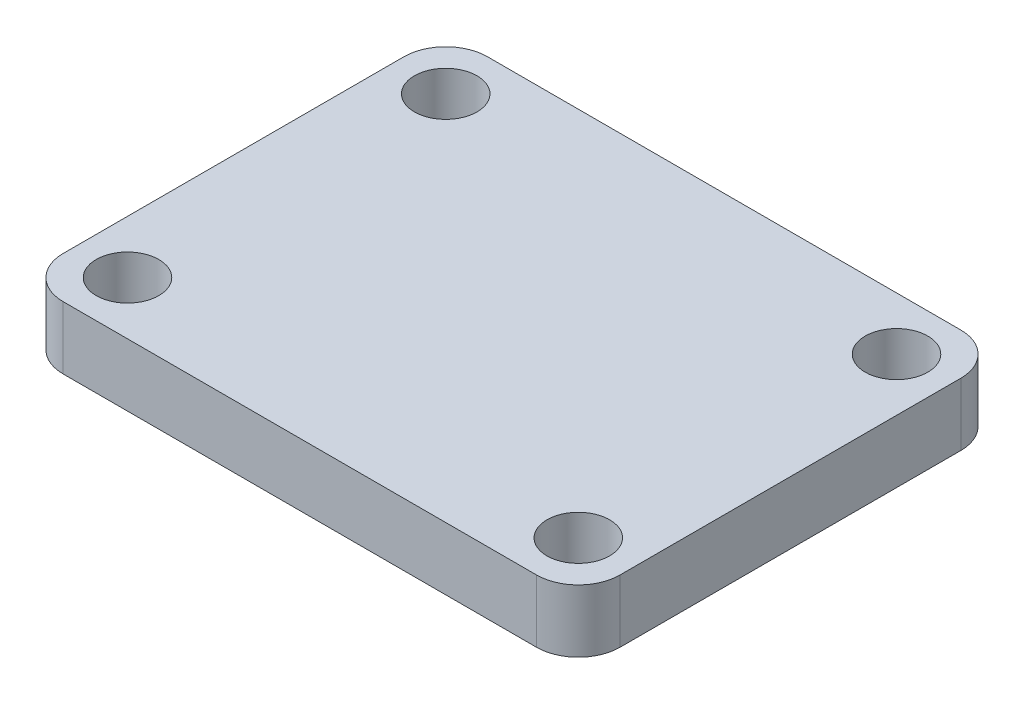
ISO-10303-21;
HEADER;
FILE_DESCRIPTION(('STEP AP214'),'2;1');
FILE_NAME('part.step','',(''),(''),'','','');
FILE_SCHEMA(('AUTOMOTIVE_DESIGN { 1 0 10303 214 1 1 1 1 }'));
ENDSEC;
DATA;
#1=APPLICATION_CONTEXT('core data for automotive mechanical design processes');
#2=APPLICATION_PROTOCOL_DEFINITION('international standard','automotive_design',2000,#1);
#3=PRODUCT_CONTEXT('',#1,'mechanical');
#4=PRODUCT('Part','Part','',(#3));
#5=PRODUCT_RELATED_PRODUCT_CATEGORY('part','',(#4));
#6=PRODUCT_DEFINITION_FORMATION('','',#4);
#7=PRODUCT_DEFINITION_CONTEXT('part definition',#1,'design');
#8=PRODUCT_DEFINITION('design','',#6,#7);
#9=PRODUCT_DEFINITION_SHAPE('','',#8);
#10=(LENGTH_UNIT() NAMED_UNIT(*) SI_UNIT(.MILLI.,.METRE.));
#11=(NAMED_UNIT(*) PLANE_ANGLE_UNIT() SI_UNIT($,.RADIAN.));
#12=(NAMED_UNIT(*) SI_UNIT($,.STERADIAN.) SOLID_ANGLE_UNIT());
#13=UNCERTAINTY_MEASURE_WITH_UNIT(LENGTH_MEASURE(1.E-05),#10,'distance_accuracy_value','');
#14=(GEOMETRIC_REPRESENTATION_CONTEXT(3) GLOBAL_UNCERTAINTY_ASSIGNED_CONTEXT((#13)) GLOBAL_UNIT_ASSIGNED_CONTEXT((#10,
#11,#12)) REPRESENTATION_CONTEXT('',''));
#15=CARTESIAN_POINT('',(0.,0.,0.));
#16=DIRECTION('',(0.,0.,1.));
#17=DIRECTION('',(1.,0.,0.));
#18=AXIS2_PLACEMENT_3D('',#15,#16,#17);
#19=CARTESIAN_POINT('',(0.,3.,-20.32));
#20=DIRECTION('',(0.,0.,-1.));
#21=DIRECTION('',(-1.,0.,0.));
#22=AXIS2_PLACEMENT_3D('',#19,#20,#21);
#23=PLANE('',#22);
#24=DIRECTION('',(1.,0.,0.));
#25=VECTOR('',#24,1.);
#26=CARTESIAN_POINT('',(0.,3.,-20.32));
#27=LINE('',#26,#25);
#28=CARTESIAN_POINT('',(2.,3.,-20.32));
#29=VERTEX_POINT('',#28);
#30=CARTESIAN_POINT('',(24.67,3.,-20.32));
#31=VERTEX_POINT('',#30);
#32=EDGE_CURVE('E162',#29,#31,#27,.T.);
#33=ORIENTED_EDGE('',*,*,#32,.T.);
#34=DIRECTION('',(0.,-1.,0.));
#35=VECTOR('',#34,1.);
#36=CARTESIAN_POINT('',(24.67,0.,-20.32));
#37=LINE('',#36,#35);
#38=CARTESIAN_POINT('',(24.67,0.,-20.32));
#39=VERTEX_POINT('',#38);
#40=EDGE_CURVE('E109',#31,#39,#37,.T.);
#41=ORIENTED_EDGE('',*,*,#40,.T.);
#42=DIRECTION('',(1.,0.,0.));
#43=VECTOR('',#42,1.);
#44=CARTESIAN_POINT('',(0.,0.,-20.32));
#45=LINE('',#44,#43);
#46=CARTESIAN_POINT('',(2.,0.,-20.32));
#47=VERTEX_POINT('',#46);
#48=EDGE_CURVE('E101',#47,#39,#45,.T.);
#49=ORIENTED_EDGE('',*,*,#48,.F.);
#50=DIRECTION('',(0.,-1.,0.));
#51=VECTOR('',#50,1.);
#52=CARTESIAN_POINT('',(2.,3.,-20.32));
#53=LINE('',#52,#51);
#54=EDGE_CURVE('E114',#47,#29,#53,.F.);
#55=ORIENTED_EDGE('',*,*,#54,.T.);
#56=EDGE_LOOP('',(#33,#41,#49,#55));
#57=FACE_BOUND('',#56,.T.);
#58=ADVANCED_FACE('F32',(#57),#23,.T.);
#59=CARTESIAN_POINT('',(0.,3.,0.));
#60=DIRECTION('',(-1.,0.,0.));
#61=DIRECTION('',(0.,0.,1.));
#62=AXIS2_PLACEMENT_3D('',#59,#60,#61);
#63=PLANE('',#62);
#64=DIRECTION('',(0.,0.,-1.));
#65=VECTOR('',#64,1.);
#66=CARTESIAN_POINT('',(0.,0.,0.));
#67=LINE('',#66,#65);
#68=CARTESIAN_POINT('',(0.,0.,-2.));
#69=VERTEX_POINT('',#68);
#70=CARTESIAN_POINT('',(0.,0.,-18.32));
#71=VERTEX_POINT('',#70);
#72=EDGE_CURVE('E103',#69,#71,#67,.T.);
#73=ORIENTED_EDGE('',*,*,#72,.F.);
#74=DIRECTION('',(0.,-1.,0.));
#75=VECTOR('',#74,1.);
#76=CARTESIAN_POINT('',(0.,3.,-2.));
#77=LINE('',#76,#75);
#78=CARTESIAN_POINT('',(0.,3.,-2.));
#79=VERTEX_POINT('',#78);
#80=EDGE_CURVE('E11',#69,#79,#77,.F.);
#81=ORIENTED_EDGE('',*,*,#80,.T.);
#82=DIRECTION('',(0.,0.,-1.));
#83=VECTOR('',#82,1.);
#84=CARTESIAN_POINT('',(0.,3.,0.));
#85=LINE('',#84,#83);
#86=CARTESIAN_POINT('',(0.,3.,-18.32));
#87=VERTEX_POINT('',#86);
#88=EDGE_CURVE('E122',#79,#87,#85,.T.);
#89=ORIENTED_EDGE('',*,*,#88,.T.);
#90=DIRECTION('',(0.,-1.,0.));
#91=VECTOR('',#90,1.);
#92=CARTESIAN_POINT('',(0.,3.,-18.32));
#93=LINE('',#92,#91);
#94=EDGE_CURVE('E40',#87,#71,#93,.T.);
#95=ORIENTED_EDGE('',*,*,#94,.T.);
#96=EDGE_LOOP('',(#73,#81,#89,#95));
#97=FACE_BOUND('',#96,.T.);
#98=ADVANCED_FACE('F151',(#97),#63,.T.);
#99=CARTESIAN_POINT('',(0.,3.,0.));
#100=DIRECTION('',(0.,0.,-1.));
#101=DIRECTION('',(-1.,0.,0.));
#102=AXIS2_PLACEMENT_3D('',#99,#100,#101);
#103=PLANE('',#102);
#104=DIRECTION('',(1.,0.,0.));
#105=VECTOR('',#104,1.);
#106=CARTESIAN_POINT('',(0.,0.,0.));
#107=LINE('',#106,#105);
#108=CARTESIAN_POINT('',(2.,0.,0.));
#109=VERTEX_POINT('',#108);
#110=CARTESIAN_POINT('',(24.67,0.,0.));
#111=VERTEX_POINT('',#110);
#112=EDGE_CURVE('E160',#109,#111,#107,.T.);
#113=ORIENTED_EDGE('',*,*,#112,.T.);
#114=DIRECTION('',(0.,-1.,0.));
#115=VECTOR('',#114,1.);
#116=CARTESIAN_POINT('',(24.67,3.,0.));
#117=LINE('',#116,#115);
#118=CARTESIAN_POINT('',(24.67,3.,0.));
#119=VERTEX_POINT('',#118);
#120=EDGE_CURVE('E47',#111,#119,#117,.F.);
#121=ORIENTED_EDGE('',*,*,#120,.T.);
#122=DIRECTION('',(1.,0.,0.));
#123=VECTOR('',#122,1.);
#124=CARTESIAN_POINT('',(0.,3.,0.));
#125=LINE('',#124,#123);
#126=CARTESIAN_POINT('',(2.,3.,0.));
#127=VERTEX_POINT('',#126);
#128=EDGE_CURVE('E126',#127,#119,#125,.T.);
#129=ORIENTED_EDGE('',*,*,#128,.F.);
#130=DIRECTION('',(0.,-1.,0.));
#131=VECTOR('',#130,1.);
#132=CARTESIAN_POINT('',(2.,0.,0.));
#133=LINE('',#132,#131);
#134=EDGE_CURVE('E147',#127,#109,#133,.T.);
#135=ORIENTED_EDGE('',*,*,#134,.T.);
#136=EDGE_LOOP('',(#113,#121,#129,#135));
#137=FACE_BOUND('',#136,.T.);
#138=ADVANCED_FACE('F159',(#137),#103,.F.);
#139=CARTESIAN_POINT('',(26.67,3.,0.));
#140=DIRECTION('',(-1.,0.,0.));
#141=DIRECTION('',(0.,0.,1.));
#142=AXIS2_PLACEMENT_3D('',#139,#140,#141);
#143=PLANE('',#142);
#144=DIRECTION('',(0.,0.,-1.));
#145=VECTOR('',#144,1.);
#146=CARTESIAN_POINT('',(26.67,0.,0.));
#147=LINE('',#146,#145);
#148=CARTESIAN_POINT('',(26.67,0.,-2.));
#149=VERTEX_POINT('',#148);
#150=CARTESIAN_POINT('',(26.67,0.,-18.32));
#151=VERTEX_POINT('',#150);
#152=EDGE_CURVE('E117',#149,#151,#147,.T.);
#153=ORIENTED_EDGE('',*,*,#152,.T.);
#154=DIRECTION('',(0.,-1.,0.));
#155=VECTOR('',#154,1.);
#156=CARTESIAN_POINT('',(26.67,3.,-18.32));
#157=LINE('',#156,#155);
#158=CARTESIAN_POINT('',(26.67,3.,-18.32));
#159=VERTEX_POINT('',#158);
#160=EDGE_CURVE('E139',#151,#159,#157,.F.);
#161=ORIENTED_EDGE('',*,*,#160,.T.);
#162=DIRECTION('',(0.,0.,-1.));
#163=VECTOR('',#162,1.);
#164=CARTESIAN_POINT('',(26.67,3.,0.));
#165=LINE('',#164,#163);
#166=CARTESIAN_POINT('',(26.67,3.,-2.));
#167=VERTEX_POINT('',#166);
#168=EDGE_CURVE('E167',#167,#159,#165,.T.);
#169=ORIENTED_EDGE('',*,*,#168,.F.);
#170=DIRECTION('',(0.,-1.,0.));
#171=VECTOR('',#170,1.);
#172=CARTESIAN_POINT('',(26.67,3.,-2.));
#173=LINE('',#172,#171);
#174=EDGE_CURVE('E136',#167,#149,#173,.T.);
#175=ORIENTED_EDGE('',*,*,#174,.T.);
#176=EDGE_LOOP('',(#153,#161,#169,#175));
#177=FACE_BOUND('',#176,.T.);
#178=ADVANCED_FACE('F206',(#177),#143,.F.);
#179=CARTESIAN_POINT('',(0.,3.,0.));
#180=DIRECTION('',(0.,1.,0.));
#181=DIRECTION('',(0.,0.,1.));
#182=AXIS2_PLACEMENT_3D('',#179,#180,#181);
#183=PLANE('',#182);
#184=CARTESIAN_POINT('',(24.13,3.,-17.78));
#185=DIRECTION('',(0.,1.,0.));
#186=DIRECTION('',(0.,0.,1.));
#187=AXIS2_PLACEMENT_3D('',#184,#185,#186);
#188=CIRCLE('',#187,1.5);
#189=CARTESIAN_POINT('',(24.13,3.,-16.28));
#190=VERTEX_POINT('',#189);
#191=EDGE_CURVE('E176',#190,#190,#188,.T.);
#192=ORIENTED_EDGE('',*,*,#191,.F.);
#193=EDGE_LOOP('',(#192));
#194=FACE_BOUND('',#193,.T.);
#195=CARTESIAN_POINT('',(2.54,3.,-17.78));
#196=DIRECTION('',(0.,1.,0.));
#197=DIRECTION('',(0.,0.,1.));
#198=AXIS2_PLACEMENT_3D('',#195,#196,#197);
#199=CIRCLE('',#198,1.5);
#200=CARTESIAN_POINT('',(2.54,3.,-16.28));
#201=VERTEX_POINT('',#200);
#202=EDGE_CURVE('E182',#201,#201,#199,.T.);
#203=ORIENTED_EDGE('',*,*,#202,.F.);
#204=EDGE_LOOP('',(#203));
#205=FACE_BOUND('',#204,.T.);
#206=CARTESIAN_POINT('',(2.54,3.,-2.54));
#207=DIRECTION('',(0.,1.,0.));
#208=DIRECTION('',(0.,0.,1.));
#209=AXIS2_PLACEMENT_3D('',#206,#207,#208);
#210=CIRCLE('',#209,1.5);
#211=CARTESIAN_POINT('',(2.54,3.,-1.04));
#212=VERTEX_POINT('',#211);
#213=EDGE_CURVE('E188',#212,#212,#210,.T.);
#214=ORIENTED_EDGE('',*,*,#213,.F.);
#215=EDGE_LOOP('',(#214));
#216=FACE_BOUND('',#215,.T.);
#217=CARTESIAN_POINT('',(24.13,3.,-2.54));
#218=DIRECTION('',(0.,1.,0.));
#219=DIRECTION('',(0.,0.,1.));
#220=AXIS2_PLACEMENT_3D('',#217,#218,#219);
#221=CIRCLE('',#220,1.5);
#222=CARTESIAN_POINT('',(24.13,3.,-1.04));
#223=VERTEX_POINT('',#222);
#224=EDGE_CURVE('E170',#223,#223,#221,.T.);
#225=ORIENTED_EDGE('',*,*,#224,.F.);
#226=EDGE_LOOP('',(#225));
#227=FACE_BOUND('',#226,.T.);
#228=ORIENTED_EDGE('',*,*,#168,.T.);
#229=CARTESIAN_POINT('',(24.67,3.,-18.32));
#230=DIRECTION('',(0.,1.,0.));
#231=DIRECTION('',(0.,0.,1.));
#232=AXIS2_PLACEMENT_3D('',#229,#230,#231);
#233=CIRCLE('',#232,2.);
#234=EDGE_CURVE('E145',#159,#31,#233,.T.);
#235=ORIENTED_EDGE('',*,*,#234,.T.);
#236=ORIENTED_EDGE('',*,*,#32,.F.);
#237=CARTESIAN_POINT('',(2.,3.,-18.32));
#238=DIRECTION('',(0.,1.,0.));
#239=DIRECTION('',(0.,0.,1.));
#240=AXIS2_PLACEMENT_3D('',#237,#238,#239);
#241=CIRCLE('',#240,2.);
#242=EDGE_CURVE('E121',#29,#87,#241,.T.);
#243=ORIENTED_EDGE('',*,*,#242,.T.);
#244=ORIENTED_EDGE('',*,*,#88,.F.);
#245=CARTESIAN_POINT('',(2.,3.,-2.));
#246=DIRECTION('',(0.,1.,0.));
#247=DIRECTION('',(0.,0.,1.));
#248=AXIS2_PLACEMENT_3D('',#245,#246,#247);
#249=CIRCLE('',#248,2.);
#250=EDGE_CURVE('E54',#79,#127,#249,.T.);
#251=ORIENTED_EDGE('',*,*,#250,.T.);
#252=ORIENTED_EDGE('',*,*,#128,.T.);
#253=CARTESIAN_POINT('',(24.67,3.,-2.));
#254=DIRECTION('',(0.,1.,0.));
#255=DIRECTION('',(0.,0.,1.));
#256=AXIS2_PLACEMENT_3D('',#253,#254,#255);
#257=CIRCLE('',#256,2.);
#258=EDGE_CURVE('E143',#119,#167,#257,.T.);
#259=ORIENTED_EDGE('',*,*,#258,.T.);
#260=EDGE_LOOP('',(#228,#235,#236,#243,#244,#251,#252,#259));
#261=FACE_BOUND('',#260,.T.);
#262=ADVANCED_FACE('F154',(#194,#205,#216,#227,#261),#183,.T.);
#263=CARTESIAN_POINT('',(0.,0.,0.));
#264=DIRECTION('',(0.,1.,0.));
#265=DIRECTION('',(0.,0.,1.));
#266=AXIS2_PLACEMENT_3D('',#263,#264,#265);
#267=PLANE('',#266);
#268=CARTESIAN_POINT('',(24.13,0.,-17.78));
#269=DIRECTION('',(0.,1.,0.));
#270=DIRECTION('',(0.,0.,1.));
#271=AXIS2_PLACEMENT_3D('',#268,#269,#270);
#272=CIRCLE('',#271,1.5);
#273=CARTESIAN_POINT('',(24.13,0.,-16.28));
#274=VERTEX_POINT('',#273);
#275=EDGE_CURVE('E179',#274,#274,#272,.T.);
#276=ORIENTED_EDGE('',*,*,#275,.T.);
#277=EDGE_LOOP('',(#276));
#278=FACE_BOUND('',#277,.T.);
#279=CARTESIAN_POINT('',(2.54,0.,-17.78));
#280=DIRECTION('',(0.,1.,0.));
#281=DIRECTION('',(0.,0.,1.));
#282=AXIS2_PLACEMENT_3D('',#279,#280,#281);
#283=CIRCLE('',#282,1.5);
#284=CARTESIAN_POINT('',(2.54,0.,-16.28));
#285=VERTEX_POINT('',#284);
#286=EDGE_CURVE('E185',#285,#285,#283,.T.);
#287=ORIENTED_EDGE('',*,*,#286,.T.);
#288=EDGE_LOOP('',(#287));
#289=FACE_BOUND('',#288,.T.);
#290=CARTESIAN_POINT('',(2.54,0.,-2.54));
#291=DIRECTION('',(0.,1.,0.));
#292=DIRECTION('',(0.,0.,1.));
#293=AXIS2_PLACEMENT_3D('',#290,#291,#292);
#294=CIRCLE('',#293,1.5);
#295=CARTESIAN_POINT('',(2.54,0.,-1.04));
#296=VERTEX_POINT('',#295);
#297=EDGE_CURVE('E173',#296,#296,#294,.T.);
#298=ORIENTED_EDGE('',*,*,#297,.T.);
#299=EDGE_LOOP('',(#298));
#300=FACE_BOUND('',#299,.T.);
#301=CARTESIAN_POINT('',(24.13,0.,-2.54));
#302=DIRECTION('',(0.,1.,0.));
#303=DIRECTION('',(0.,0.,1.));
#304=AXIS2_PLACEMENT_3D('',#301,#302,#303);
#305=CIRCLE('',#304,1.5);
#306=CARTESIAN_POINT('',(24.13,0.,-1.04));
#307=VERTEX_POINT('',#306);
#308=EDGE_CURVE('E118',#307,#307,#305,.T.);
#309=ORIENTED_EDGE('',*,*,#308,.T.);
#310=EDGE_LOOP('',(#309));
#311=FACE_BOUND('',#310,.T.);
#312=ORIENTED_EDGE('',*,*,#48,.T.);
#313=CARTESIAN_POINT('',(24.67,0.,-18.32));
#314=DIRECTION('',(0.,1.,0.));
#315=DIRECTION('',(0.,0.,1.));
#316=AXIS2_PLACEMENT_3D('',#313,#314,#315);
#317=CIRCLE('',#316,2.);
#318=EDGE_CURVE('E134',#39,#151,#317,.F.);
#319=ORIENTED_EDGE('',*,*,#318,.T.);
#320=ORIENTED_EDGE('',*,*,#152,.F.);
#321=CARTESIAN_POINT('',(24.67,0.,-2.));
#322=DIRECTION('',(0.,1.,0.));
#323=DIRECTION('',(0.,0.,1.));
#324=AXIS2_PLACEMENT_3D('',#321,#322,#323);
#325=CIRCLE('',#324,2.);
#326=EDGE_CURVE('E132',#149,#111,#325,.F.);
#327=ORIENTED_EDGE('',*,*,#326,.T.);
#328=ORIENTED_EDGE('',*,*,#112,.F.);
#329=CARTESIAN_POINT('',(2.,0.,-2.));
#330=DIRECTION('',(0.,1.,0.));
#331=DIRECTION('',(0.,0.,1.));
#332=AXIS2_PLACEMENT_3D('',#329,#330,#331);
#333=CIRCLE('',#332,2.);
#334=EDGE_CURVE('E108',#109,#69,#333,.F.);
#335=ORIENTED_EDGE('',*,*,#334,.T.);
#336=ORIENTED_EDGE('',*,*,#72,.T.);
#337=CARTESIAN_POINT('',(2.,0.,-18.32));
#338=DIRECTION('',(0.,1.,0.));
#339=DIRECTION('',(0.,0.,1.));
#340=AXIS2_PLACEMENT_3D('',#337,#338,#339);
#341=CIRCLE('',#340,2.);
#342=EDGE_CURVE('E98',#71,#47,#341,.F.);
#343=ORIENTED_EDGE('',*,*,#342,.T.);
#344=EDGE_LOOP('',(#312,#319,#320,#327,#328,#335,#336,#343));
#345=FACE_BOUND('',#344,.T.);
#346=ADVANCED_FACE('F100',(#278,#289,#300,#311,#345),#267,.F.);
#347=CARTESIAN_POINT('',(24.13,0.,-2.54));
#348=DIRECTION('',(0.,1.,0.));
#349=DIRECTION('',(0.,0.,1.));
#350=AXIS2_PLACEMENT_3D('',#347,#348,#349);
#351=CYLINDRICAL_SURFACE('',#350,1.5);
#352=ORIENTED_EDGE('',*,*,#308,.F.);
#353=EDGE_LOOP('',(#352));
#354=FACE_BOUND('',#353,.T.);
#355=ORIENTED_EDGE('',*,*,#224,.T.);
#356=EDGE_LOOP('',(#355));
#357=FACE_BOUND('',#356,.T.);
#358=ADVANCED_FACE('F200',(#354,#357),#351,.F.);
#359=CARTESIAN_POINT('',(2.54,0.,-2.54));
#360=DIRECTION('',(0.,1.,0.));
#361=DIRECTION('',(0.,0.,1.));
#362=AXIS2_PLACEMENT_3D('',#359,#360,#361);
#363=CYLINDRICAL_SURFACE('',#362,1.5);
#364=ORIENTED_EDGE('',*,*,#297,.F.);
#365=EDGE_LOOP('',(#364));
#366=FACE_BOUND('',#365,.T.);
#367=ORIENTED_EDGE('',*,*,#213,.T.);
#368=EDGE_LOOP('',(#367));
#369=FACE_BOUND('',#368,.T.);
#370=ADVANCED_FACE('F196',(#366,#369),#363,.F.);
#371=CARTESIAN_POINT('',(2.54,0.,-17.78));
#372=DIRECTION('',(0.,1.,0.));
#373=DIRECTION('',(0.,0.,1.));
#374=AXIS2_PLACEMENT_3D('',#371,#372,#373);
#375=CYLINDRICAL_SURFACE('',#374,1.5);
#376=ORIENTED_EDGE('',*,*,#286,.F.);
#377=EDGE_LOOP('',(#376));
#378=FACE_BOUND('',#377,.T.);
#379=ORIENTED_EDGE('',*,*,#202,.T.);
#380=EDGE_LOOP('',(#379));
#381=FACE_BOUND('',#380,.T.);
#382=ADVANCED_FACE('F199',(#378,#381),#375,.F.);
#383=CARTESIAN_POINT('',(24.13,0.,-17.78));
#384=DIRECTION('',(0.,1.,0.));
#385=DIRECTION('',(0.,0.,1.));
#386=AXIS2_PLACEMENT_3D('',#383,#384,#385);
#387=CYLINDRICAL_SURFACE('',#386,1.5);
#388=ORIENTED_EDGE('',*,*,#275,.F.);
#389=EDGE_LOOP('',(#388));
#390=FACE_BOUND('',#389,.T.);
#391=ORIENTED_EDGE('',*,*,#191,.T.);
#392=EDGE_LOOP('',(#391));
#393=FACE_BOUND('',#392,.T.);
#394=ADVANCED_FACE('F234',(#390,#393),#387,.F.);
#395=CARTESIAN_POINT('',(24.67,3.,-18.32));
#396=DIRECTION('',(0.,1.,0.));
#397=DIRECTION('',(0.,0.,1.));
#398=AXIS2_PLACEMENT_3D('',#395,#396,#397);
#399=CYLINDRICAL_SURFACE('',#398,2.);
#400=ORIENTED_EDGE('',*,*,#234,.F.);
#401=ORIENTED_EDGE('',*,*,#160,.F.);
#402=ORIENTED_EDGE('',*,*,#318,.F.);
#403=ORIENTED_EDGE('',*,*,#40,.F.);
#404=EDGE_LOOP('',(#400,#401,#402,#403));
#405=FACE_BOUND('',#404,.T.);
#406=ADVANCED_FACE('F230',(#405),#399,.T.);
#407=CARTESIAN_POINT('',(24.67,3.,-2.));
#408=DIRECTION('',(0.,-1.,0.));
#409=DIRECTION('',(0.,0.,-1.));
#410=AXIS2_PLACEMENT_3D('',#407,#408,#409);
#411=CYLINDRICAL_SURFACE('',#410,2.);
#412=ORIENTED_EDGE('',*,*,#258,.F.);
#413=ORIENTED_EDGE('',*,*,#120,.F.);
#414=ORIENTED_EDGE('',*,*,#326,.F.);
#415=ORIENTED_EDGE('',*,*,#174,.F.);
#416=EDGE_LOOP('',(#412,#413,#414,#415));
#417=FACE_BOUND('',#416,.T.);
#418=ADVANCED_FACE('F233',(#417),#411,.T.);
#419=CARTESIAN_POINT('',(2.,3.,-2.));
#420=DIRECTION('',(0.,1.,0.));
#421=DIRECTION('',(0.,0.,1.));
#422=AXIS2_PLACEMENT_3D('',#419,#420,#421);
#423=CYLINDRICAL_SURFACE('',#422,2.);
#424=ORIENTED_EDGE('',*,*,#250,.F.);
#425=ORIENTED_EDGE('',*,*,#80,.F.);
#426=ORIENTED_EDGE('',*,*,#334,.F.);
#427=ORIENTED_EDGE('',*,*,#134,.F.);
#428=EDGE_LOOP('',(#424,#425,#426,#427));
#429=FACE_BOUND('',#428,.T.);
#430=ADVANCED_FACE('F157',(#429),#423,.T.);
#431=CARTESIAN_POINT('',(2.,3.,-18.32));
#432=DIRECTION('',(0.,-1.,0.));
#433=DIRECTION('',(0.,0.,-1.));
#434=AXIS2_PLACEMENT_3D('',#431,#432,#433);
#435=CYLINDRICAL_SURFACE('',#434,2.);
#436=ORIENTED_EDGE('',*,*,#242,.F.);
#437=ORIENTED_EDGE('',*,*,#54,.F.);
#438=ORIENTED_EDGE('',*,*,#342,.F.);
#439=ORIENTED_EDGE('',*,*,#94,.F.);
#440=EDGE_LOOP('',(#436,#437,#438,#439));
#441=FACE_BOUND('',#440,.T.);
#442=ADVANCED_FACE('F34',(#441),#435,.T.);
#443=CLOSED_SHELL('',(#58,#98,#138,#178,#262,#346,#358,#370,#382,#394,#406,#418,#430,#442));
#444=MANIFOLD_SOLID_BREP('B2',#443);
#445=ADVANCED_BREP_SHAPE_REPRESENTATION('',(#18,#444),#14);
#446=SHAPE_DEFINITION_REPRESENTATION(#9,#445);
ENDSEC;
END-ISO-10303-21;
